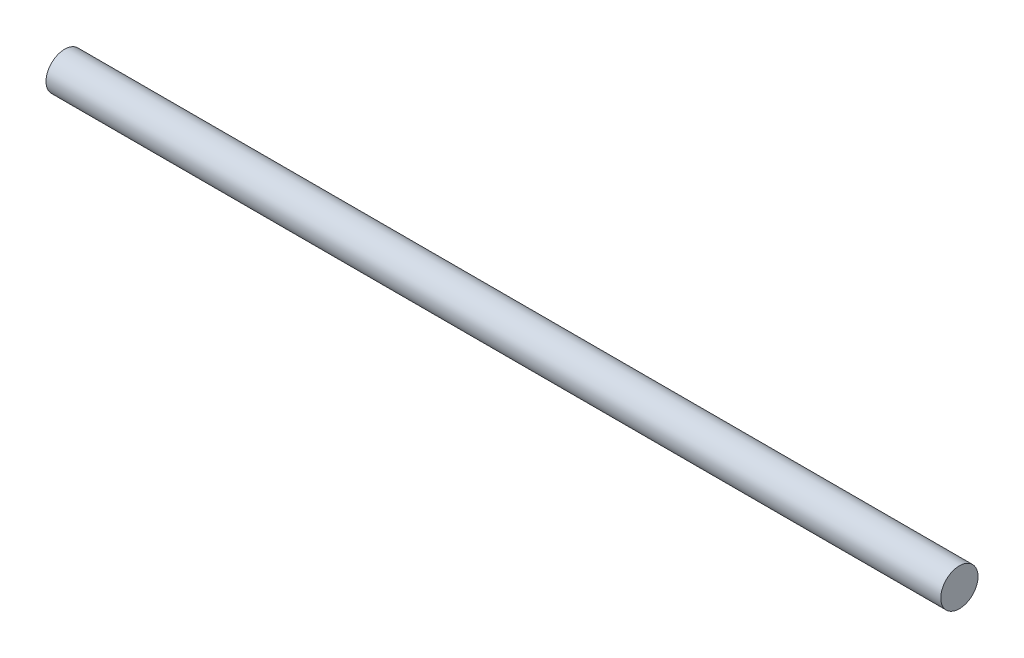
ISO-10303-21;
HEADER;
FILE_DESCRIPTION(('STEP AP214'),'2;1');
FILE_NAME('part.step','',(''),(''),'','','');
FILE_SCHEMA(('AUTOMOTIVE_DESIGN { 1 0 10303 214 1 1 1 1 }'));
ENDSEC;
DATA;
#1=APPLICATION_CONTEXT('core data for automotive mechanical design processes');
#2=APPLICATION_PROTOCOL_DEFINITION('international standard','automotive_design',2000,#1);
#3=PRODUCT_CONTEXT('',#1,'mechanical');
#4=PRODUCT('Part','Part','',(#3));
#5=PRODUCT_RELATED_PRODUCT_CATEGORY('part','',(#4));
#6=PRODUCT_DEFINITION_FORMATION('','',#4);
#7=PRODUCT_DEFINITION_CONTEXT('part definition',#1,'design');
#8=PRODUCT_DEFINITION('design','',#6,#7);
#9=PRODUCT_DEFINITION_SHAPE('','',#8);
#10=(LENGTH_UNIT() NAMED_UNIT(*) SI_UNIT(.MILLI.,.METRE.));
#11=(NAMED_UNIT(*) PLANE_ANGLE_UNIT() SI_UNIT($,.RADIAN.));
#12=(NAMED_UNIT(*) SI_UNIT($,.STERADIAN.) SOLID_ANGLE_UNIT());
#13=UNCERTAINTY_MEASURE_WITH_UNIT(LENGTH_MEASURE(1.E-05),#10,'distance_accuracy_value','');
#14=(GEOMETRIC_REPRESENTATION_CONTEXT(3) GLOBAL_UNCERTAINTY_ASSIGNED_CONTEXT((#13)) GLOBAL_UNIT_ASSIGNED_CONTEXT((#10,
#11,#12)) REPRESENTATION_CONTEXT('',''));
#15=CARTESIAN_POINT('',(0.,0.,0.));
#16=DIRECTION('',(0.,0.,1.));
#17=DIRECTION('',(1.,0.,0.));
#18=AXIS2_PLACEMENT_3D('',#15,#16,#17);
#19=CARTESIAN_POINT('',(152.4,0.,0.));
#20=DIRECTION('',(-1.,0.,0.));
#21=DIRECTION('',(0.,0.,1.));
#22=AXIS2_PLACEMENT_3D('',#19,#20,#21);
#23=CYLINDRICAL_SURFACE('',#22,3.175);
#24=CARTESIAN_POINT('',(152.4,0.,0.));
#25=DIRECTION('',(1.,0.,0.));
#26=DIRECTION('',(0.,0.,-1.));
#27=AXIS2_PLACEMENT_3D('',#24,#25,#26);
#28=CIRCLE('',#27,3.175);
#29=CARTESIAN_POINT('',(152.4,0.,3.175));
#30=VERTEX_POINT('',#29);
#31=EDGE_CURVE('E10',#30,#30,#28,.T.);
#32=CARTESIAN_POINT('',(0.,0.,0.));
#33=DIRECTION('',(1.,0.,0.));
#34=DIRECTION('',(0.,0.,-1.));
#35=AXIS2_PLACEMENT_3D('',#32,#33,#34);
#36=CIRCLE('',#35,3.175);
#37=CARTESIAN_POINT('',(0.,0.,3.175));
#38=VERTEX_POINT('',#37);
#39=EDGE_CURVE('E34',#38,#38,#36,.T.);
#40=CARTESIAN_POINT('',(152.4,0.,3.175));
#41=CARTESIAN_POINT('',(150.8125,0.,3.175));
#42=CARTESIAN_POINT('',(149.225,0.,3.175));
#43=CARTESIAN_POINT('',(146.05,0.,3.175));
#44=CARTESIAN_POINT('',(144.4625,0.,3.175));
#45=CARTESIAN_POINT('',(141.2875,0.,3.175));
#46=CARTESIAN_POINT('',(139.7,0.,3.175));
#47=CARTESIAN_POINT('',(136.525,0.,3.175));
#48=CARTESIAN_POINT('',(134.9375,0.,3.175));
#49=CARTESIAN_POINT('',(131.7625,0.,3.175));
#50=CARTESIAN_POINT('',(130.175,0.,3.175));
#51=CARTESIAN_POINT('',(127.,0.,3.175));
#52=CARTESIAN_POINT('',(125.4125,0.,3.175));
#53=CARTESIAN_POINT('',(122.2375,0.,3.175));
#54=CARTESIAN_POINT('',(120.65,0.,3.175));
#55=CARTESIAN_POINT('',(117.475,0.,3.175));
#56=CARTESIAN_POINT('',(115.8875,0.,3.175));
#57=CARTESIAN_POINT('',(112.7125,0.,3.175));
#58=CARTESIAN_POINT('',(111.125,0.,3.175));
#59=CARTESIAN_POINT('',(107.95,0.,3.175));
#60=CARTESIAN_POINT('',(106.3625,0.,3.175));
#61=CARTESIAN_POINT('',(103.1875,0.,3.175));
#62=CARTESIAN_POINT('',(101.6,0.,3.175));
#63=CARTESIAN_POINT('',(98.425,0.,3.175));
#64=CARTESIAN_POINT('',(96.8375,0.,3.175));
#65=CARTESIAN_POINT('',(93.6625,0.,3.175));
#66=CARTESIAN_POINT('',(92.075,0.,3.175));
#67=CARTESIAN_POINT('',(88.9,0.,3.175));
#68=CARTESIAN_POINT('',(87.3125,0.,3.175));
#69=CARTESIAN_POINT('',(84.1375,0.,3.175));
#70=CARTESIAN_POINT('',(82.55,0.,3.175));
#71=CARTESIAN_POINT('',(79.375,0.,3.175));
#72=CARTESIAN_POINT('',(77.7875,0.,3.175));
#73=CARTESIAN_POINT('',(74.6125,0.,3.175));
#74=CARTESIAN_POINT('',(73.025,0.,3.175));
#75=CARTESIAN_POINT('',(69.85,0.,3.175));
#76=CARTESIAN_POINT('',(68.2625,0.,3.175));
#77=CARTESIAN_POINT('',(65.0875,0.,3.175));
#78=CARTESIAN_POINT('',(63.5,0.,3.175));
#79=CARTESIAN_POINT('',(60.325,0.,3.175));
#80=CARTESIAN_POINT('',(58.7375,0.,3.175));
#81=CARTESIAN_POINT('',(55.5625,0.,3.175));
#82=CARTESIAN_POINT('',(53.975,0.,3.175));
#83=CARTESIAN_POINT('',(50.8,0.,3.175));
#84=CARTESIAN_POINT('',(49.2125,0.,3.175));
#85=CARTESIAN_POINT('',(46.0375,0.,3.175));
#86=CARTESIAN_POINT('',(44.45,0.,3.175));
#87=CARTESIAN_POINT('',(41.275,0.,3.175));
#88=CARTESIAN_POINT('',(39.6875,0.,3.175));
#89=CARTESIAN_POINT('',(36.5125,0.,3.175));
#90=CARTESIAN_POINT('',(34.925,0.,3.175));
#91=CARTESIAN_POINT('',(31.75,0.,3.175));
#92=CARTESIAN_POINT('',(30.1625,0.,3.175));
#93=CARTESIAN_POINT('',(26.9875,0.,3.175));
#94=CARTESIAN_POINT('',(25.4,0.,3.175));
#95=CARTESIAN_POINT('',(22.225,0.,3.175));
#96=CARTESIAN_POINT('',(20.6375,0.,3.175));
#97=CARTESIAN_POINT('',(17.4625,0.,3.175));
#98=CARTESIAN_POINT('',(15.875,0.,3.175));
#99=CARTESIAN_POINT('',(12.7,0.,3.175));
#100=CARTESIAN_POINT('',(11.1125,0.,3.175));
#101=CARTESIAN_POINT('',(7.93750000000001,0.,3.175));
#102=CARTESIAN_POINT('',(6.35,0.,3.175));
#103=CARTESIAN_POINT('',(3.175,0.,3.175));
#104=CARTESIAN_POINT('',(1.5875,0.,3.175));
#105=CARTESIAN_POINT('',(0.,0.,3.175));
#106=B_SPLINE_CURVE_WITH_KNOTS('',3,(#40,#41,#42,#43,#44,#45,#46,#47,#48,#49,#50,#51,#52,#53,
#54,#55,#56,#57,#58,#59,#60,#61,#62,#63,#64,#65,#66,#67,#68,#69,#70,#71,#72,#73,#74,#75,#76,#77,
#78,#79,#80,#81,#82,#83,#84,#85,#86,#87,#88,#89,#90,#91,#92,#93,#94,#95,#96,#97,#98,#99,#100,
#101,#102,#103,#104,#105),.UNSPECIFIED.,.F.,.F.,(4,2,2,2,2,2,2,2,2,2,2,2,2,2,2,2,2,2,2,2,2,2,2,
2,2,2,2,2,2,2,2,2,4),(0.,4.7625,9.52500000000001,14.2875,19.05,23.8125,28.575,33.3375,38.1,
42.8625,47.625,52.3875,57.15,61.9125,66.675,71.4375,76.2,80.9625,85.725,90.4875,95.25,100.0125,
104.775,109.5375,114.3,119.0625,123.825,128.5875,133.35,138.1125,142.875,147.6375,152.4),.UNSPECIFIED.);
#107=EDGE_CURVE('BSEAM31',#30,#38,#106,.T.);
#108=ORIENTED_EDGE('',*,*,#31,.F.);
#109=ORIENTED_EDGE('',*,*,#39,.T.);
#110=ORIENTED_EDGE('',*,*,#107,.T.);
#111=ORIENTED_EDGE('',*,*,#107,.F.);
#112=EDGE_LOOP('',(#108,#110,#109,#111));
#113=FACE_BOUND('',#112,.T.);
#114=ADVANCED_FACE('F31',(#113),#23,.T.);
#115=CARTESIAN_POINT('',(152.4,0.,0.));
#116=DIRECTION('',(1.,0.,0.));
#117=DIRECTION('',(0.,0.,-1.));
#118=AXIS2_PLACEMENT_3D('',#115,#116,#117);
#119=PLANE('',#118);
#120=ORIENTED_EDGE('',*,*,#31,.T.);
#121=EDGE_LOOP('',(#120));
#122=FACE_BOUND('',#121,.T.);
#123=ADVANCED_FACE('F46',(#122),#119,.T.);
#124=CARTESIAN_POINT('',(0.,0.,0.));
#125=DIRECTION('',(1.,0.,0.));
#126=DIRECTION('',(0.,0.,-1.));
#127=AXIS2_PLACEMENT_3D('',#124,#125,#126);
#128=PLANE('',#127);
#129=ORIENTED_EDGE('',*,*,#39,.F.);
#130=EDGE_LOOP('',(#129));
#131=FACE_BOUND('',#130,.T.);
#132=ADVANCED_FACE('F44',(#131),#128,.F.);
#133=CLOSED_SHELL('',(#114,#123,#132));
#134=MANIFOLD_SOLID_BREP('B2',#133);
#135=ADVANCED_BREP_SHAPE_REPRESENTATION('',(#18,#134),#14);
#136=SHAPE_DEFINITION_REPRESENTATION(#9,#135);
ENDSEC;
END-ISO-10303-21;
